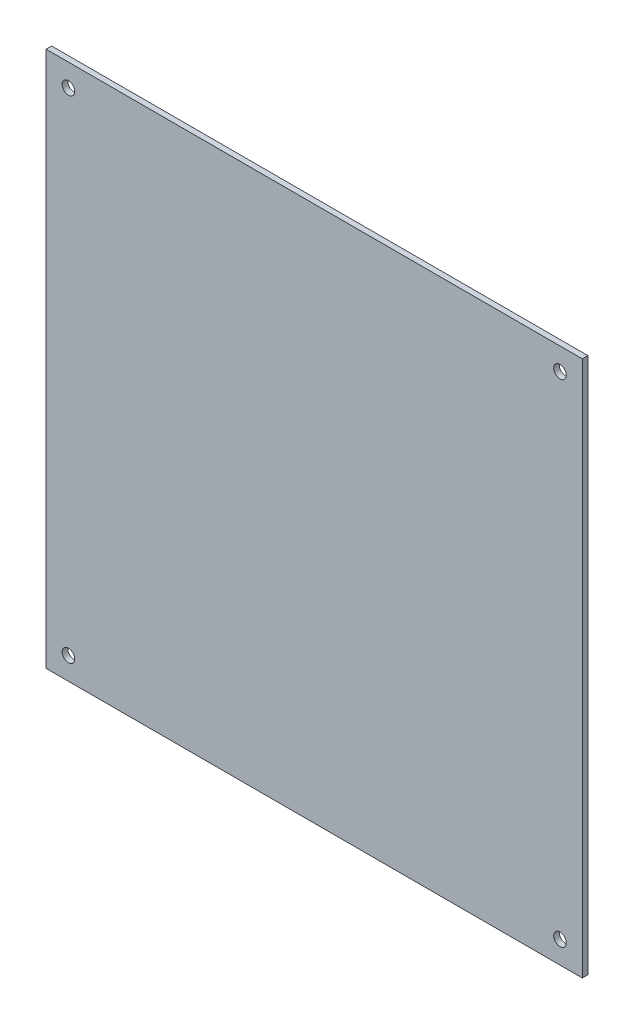
ISO-10303-21;
HEADER;
FILE_DESCRIPTION(('STEP AP214'),'2;1');
FILE_NAME('part.step','',(''),(''),'','','');
FILE_SCHEMA(('AUTOMOTIVE_DESIGN { 1 0 10303 214 1 1 1 1 }'));
ENDSEC;
DATA;
#1=APPLICATION_CONTEXT('core data for automotive mechanical design processes');
#2=APPLICATION_PROTOCOL_DEFINITION('international standard','automotive_design',2000,#1);
#3=PRODUCT_CONTEXT('',#1,'mechanical');
#4=PRODUCT('Part','Part','',(#3));
#5=PRODUCT_RELATED_PRODUCT_CATEGORY('part','',(#4));
#6=PRODUCT_DEFINITION_FORMATION('','',#4);
#7=PRODUCT_DEFINITION_CONTEXT('part definition',#1,'design');
#8=PRODUCT_DEFINITION('design','',#6,#7);
#9=PRODUCT_DEFINITION_SHAPE('','',#8);
#10=(LENGTH_UNIT() NAMED_UNIT(*) SI_UNIT(.MILLI.,.METRE.));
#11=(NAMED_UNIT(*) PLANE_ANGLE_UNIT() SI_UNIT($,.RADIAN.));
#12=(NAMED_UNIT(*) SI_UNIT($,.STERADIAN.) SOLID_ANGLE_UNIT());
#13=UNCERTAINTY_MEASURE_WITH_UNIT(LENGTH_MEASURE(1.E-05),#10,'distance_accuracy_value','');
#14=(GEOMETRIC_REPRESENTATION_CONTEXT(3) GLOBAL_UNCERTAINTY_ASSIGNED_CONTEXT((#13)) GLOBAL_UNIT_ASSIGNED_CONTEXT((#10,
#11,#12)) REPRESENTATION_CONTEXT('',''));
#15=CARTESIAN_POINT('',(0.,0.,0.));
#16=DIRECTION('',(0.,0.,1.));
#17=DIRECTION('',(1.,0.,0.));
#18=AXIS2_PLACEMENT_3D('',#15,#16,#17);
#19=CARTESIAN_POINT('',(0.,0.,3.175));
#20=DIRECTION('',(1.,0.,0.));
#21=DIRECTION('',(0.,1.,0.));
#22=AXIS2_PLACEMENT_3D('',#19,#20,#21);
#23=PLANE('',#22);
#24=DIRECTION('',(0.,-1.,0.));
#25=VECTOR('',#24,1.);
#26=CARTESIAN_POINT('',(0.,0.,0.));
#27=LINE('',#26,#25);
#28=CARTESIAN_POINT('',(0.,0.,0.));
#29=VERTEX_POINT('',#28);
#30=CARTESIAN_POINT('',(0.,-304.8,0.));
#31=VERTEX_POINT('',#30);
#32=EDGE_CURVE('E127',#29,#31,#27,.T.);
#33=ORIENTED_EDGE('',*,*,#32,.T.);
#34=DIRECTION('',(0.,0.,-1.));
#35=VECTOR('',#34,1.);
#36=CARTESIAN_POINT('',(0.,-304.8,3.175));
#37=LINE('',#36,#35);
#38=CARTESIAN_POINT('',(0.,-304.8,3.175));
#39=VERTEX_POINT('',#38);
#40=EDGE_CURVE('E11',#39,#31,#37,.T.);
#41=ORIENTED_EDGE('',*,*,#40,.F.);
#42=DIRECTION('',(0.,-1.,0.));
#43=VECTOR('',#42,1.);
#44=CARTESIAN_POINT('',(0.,0.,3.175));
#45=LINE('',#44,#43);
#46=CARTESIAN_POINT('',(0.,0.,3.175));
#47=VERTEX_POINT('',#46);
#48=EDGE_CURVE('E109',#47,#39,#45,.T.);
#49=ORIENTED_EDGE('',*,*,#48,.F.);
#50=DIRECTION('',(0.,0.,-1.));
#51=VECTOR('',#50,1.);
#52=CARTESIAN_POINT('',(0.,0.,3.175));
#53=LINE('',#52,#51);
#54=EDGE_CURVE('E123',#47,#29,#53,.T.);
#55=ORIENTED_EDGE('',*,*,#54,.T.);
#56=EDGE_LOOP('',(#33,#41,#49,#55));
#57=FACE_BOUND('',#56,.T.);
#58=ADVANCED_FACE('F51',(#57),#23,.F.);
#59=CARTESIAN_POINT('',(0.,-304.8,3.175));
#60=DIRECTION('',(0.,1.,0.));
#61=DIRECTION('',(0.,0.,1.));
#62=AXIS2_PLACEMENT_3D('',#59,#60,#61);
#63=PLANE('',#62);
#64=DIRECTION('',(1.,0.,0.));
#65=VECTOR('',#64,1.);
#66=CARTESIAN_POINT('',(0.,-304.8,0.));
#67=LINE('',#66,#65);
#68=CARTESIAN_POINT('',(304.8,-304.8,0.));
#69=VERTEX_POINT('',#68);
#70=EDGE_CURVE('E114',#31,#69,#67,.T.);
#71=ORIENTED_EDGE('',*,*,#70,.T.);
#72=DIRECTION('',(0.,0.,-1.));
#73=VECTOR('',#72,1.);
#74=CARTESIAN_POINT('',(304.8,-304.8,3.175));
#75=LINE('',#74,#73);
#76=CARTESIAN_POINT('',(304.8,-304.8,3.175));
#77=VERTEX_POINT('',#76);
#78=EDGE_CURVE('E60',#77,#69,#75,.T.);
#79=ORIENTED_EDGE('',*,*,#78,.F.);
#80=DIRECTION('',(1.,0.,0.));
#81=VECTOR('',#80,1.);
#82=CARTESIAN_POINT('',(0.,-304.8,3.175));
#83=LINE('',#82,#81);
#84=EDGE_CURVE('E103',#39,#77,#83,.T.);
#85=ORIENTED_EDGE('',*,*,#84,.F.);
#86=ORIENTED_EDGE('',*,*,#40,.T.);
#87=EDGE_LOOP('',(#71,#79,#85,#86));
#88=FACE_BOUND('',#87,.T.);
#89=ADVANCED_FACE('F113',(#88),#63,.F.);
#90=CARTESIAN_POINT('',(304.8,0.,3.175));
#91=DIRECTION('',(-1.,0.,0.));
#92=DIRECTION('',(0.,-1.,0.));
#93=AXIS2_PLACEMENT_3D('',#90,#91,#92);
#94=PLANE('',#93);
#95=DIRECTION('',(0.,1.,0.));
#96=VECTOR('',#95,1.);
#97=CARTESIAN_POINT('',(304.8,0.,0.));
#98=LINE('',#97,#96);
#99=CARTESIAN_POINT('',(304.8,0.,0.));
#100=VERTEX_POINT('',#99);
#101=EDGE_CURVE('E89',#69,#100,#98,.T.);
#102=ORIENTED_EDGE('',*,*,#101,.T.);
#103=DIRECTION('',(0.,0.,-1.));
#104=VECTOR('',#103,1.);
#105=CARTESIAN_POINT('',(304.8,0.,3.175));
#106=LINE('',#105,#104);
#107=CARTESIAN_POINT('',(304.8,0.,3.175));
#108=VERTEX_POINT('',#107);
#109=EDGE_CURVE('E116',#108,#100,#106,.T.);
#110=ORIENTED_EDGE('',*,*,#109,.F.);
#111=DIRECTION('',(0.,1.,0.));
#112=VECTOR('',#111,1.);
#113=CARTESIAN_POINT('',(304.8,0.,3.175));
#114=LINE('',#113,#112);
#115=EDGE_CURVE('E107',#77,#108,#114,.T.);
#116=ORIENTED_EDGE('',*,*,#115,.F.);
#117=ORIENTED_EDGE('',*,*,#78,.T.);
#118=EDGE_LOOP('',(#102,#110,#116,#117));
#119=FACE_BOUND('',#118,.T.);
#120=ADVANCED_FACE('F117',(#119),#94,.F.);
#121=CARTESIAN_POINT('',(0.,0.,3.175));
#122=DIRECTION('',(0.,-1.,0.));
#123=DIRECTION('',(0.,0.,-1.));
#124=AXIS2_PLACEMENT_3D('',#121,#122,#123);
#125=PLANE('',#124);
#126=DIRECTION('',(-1.,0.,0.));
#127=VECTOR('',#126,1.);
#128=CARTESIAN_POINT('',(0.,0.,0.));
#129=LINE('',#128,#127);
#130=EDGE_CURVE('E96',#100,#29,#129,.T.);
#131=ORIENTED_EDGE('',*,*,#130,.T.);
#132=ORIENTED_EDGE('',*,*,#54,.F.);
#133=DIRECTION('',(-1.,0.,0.));
#134=VECTOR('',#133,1.);
#135=CARTESIAN_POINT('',(0.,0.,3.175));
#136=LINE('',#135,#134);
#137=EDGE_CURVE('E70',#108,#47,#136,.T.);
#138=ORIENTED_EDGE('',*,*,#137,.F.);
#139=ORIENTED_EDGE('',*,*,#109,.T.);
#140=EDGE_LOOP('',(#131,#132,#138,#139));
#141=FACE_BOUND('',#140,.T.);
#142=ADVANCED_FACE('F143',(#141),#125,.F.);
#143=CARTESIAN_POINT('',(0.,0.,3.175));
#144=DIRECTION('',(0.,0.,1.));
#145=DIRECTION('',(1.,0.,0.));
#146=AXIS2_PLACEMENT_3D('',#143,#144,#145);
#147=PLANE('',#146);
#148=CARTESIAN_POINT('',(12.7,-12.7000000000001,3.175));
#149=DIRECTION('',(0.,0.,1.));
#150=DIRECTION('',(1.,0.,0.));
#151=AXIS2_PLACEMENT_3D('',#148,#149,#150);
#152=CIRCLE('',#151,3.57123999999999);
#153=CARTESIAN_POINT('',(16.27124,-12.7000000000001,3.175));
#154=VERTEX_POINT('',#153);
#155=EDGE_CURVE('E179',#154,#154,#152,.T.);
#156=ORIENTED_EDGE('',*,*,#155,.F.);
#157=EDGE_LOOP('',(#156));
#158=FACE_BOUND('',#157,.T.);
#159=CARTESIAN_POINT('',(292.1,-12.7000000000001,3.175));
#160=DIRECTION('',(0.,0.,1.));
#161=DIRECTION('',(1.,0.,0.));
#162=AXIS2_PLACEMENT_3D('',#159,#160,#161);
#163=CIRCLE('',#162,3.57123999999998);
#164=CARTESIAN_POINT('',(295.67124,-12.7000000000001,3.175));
#165=VERTEX_POINT('',#164);
#166=EDGE_CURVE('E171',#165,#165,#163,.T.);
#167=ORIENTED_EDGE('',*,*,#166,.F.);
#168=EDGE_LOOP('',(#167));
#169=FACE_BOUND('',#168,.T.);
#170=CARTESIAN_POINT('',(12.6999999999999,-292.1,3.175));
#171=DIRECTION('',(0.,0.,1.));
#172=DIRECTION('',(1.,0.,0.));
#173=AXIS2_PLACEMENT_3D('',#170,#171,#172);
#174=CIRCLE('',#173,3.57123999999999);
#175=CARTESIAN_POINT('',(16.2712399999999,-292.1,3.175));
#176=VERTEX_POINT('',#175);
#177=EDGE_CURVE('E163',#176,#176,#174,.T.);
#178=ORIENTED_EDGE('',*,*,#177,.F.);
#179=EDGE_LOOP('',(#178));
#180=FACE_BOUND('',#179,.T.);
#181=CARTESIAN_POINT('',(292.1,-292.1,3.175));
#182=DIRECTION('',(0.,0.,1.));
#183=DIRECTION('',(1.,0.,0.));
#184=AXIS2_PLACEMENT_3D('',#181,#182,#183);
#185=CIRCLE('',#184,3.57123999999998);
#186=CARTESIAN_POINT('',(295.67124,-292.1,3.175));
#187=VERTEX_POINT('',#186);
#188=EDGE_CURVE('E155',#187,#187,#185,.T.);
#189=ORIENTED_EDGE('',*,*,#188,.F.);
#190=EDGE_LOOP('',(#189));
#191=FACE_BOUND('',#190,.T.);
#192=ORIENTED_EDGE('',*,*,#48,.T.);
#193=ORIENTED_EDGE('',*,*,#84,.T.);
#194=ORIENTED_EDGE('',*,*,#115,.T.);
#195=ORIENTED_EDGE('',*,*,#137,.T.);
#196=EDGE_LOOP('',(#192,#193,#194,#195));
#197=FACE_BOUND('',#196,.T.);
#198=ADVANCED_FACE('F105',(#158,#169,#180,#191,#197),#147,.T.);
#199=CARTESIAN_POINT('',(0.,0.,0.));
#200=DIRECTION('',(0.,0.,1.));
#201=DIRECTION('',(1.,0.,0.));
#202=AXIS2_PLACEMENT_3D('',#199,#200,#201);
#203=PLANE('',#202);
#204=CARTESIAN_POINT('',(12.7,-12.7000000000001,0.));
#205=DIRECTION('',(0.,0.,1.));
#206=DIRECTION('',(1.,0.,0.));
#207=AXIS2_PLACEMENT_3D('',#204,#205,#206);
#208=CIRCLE('',#207,3.57123999999999);
#209=CARTESIAN_POINT('',(16.27124,-12.7000000000001,0.));
#210=VERTEX_POINT('',#209);
#211=EDGE_CURVE('E175',#210,#210,#208,.T.);
#212=ORIENTED_EDGE('',*,*,#211,.T.);
#213=EDGE_LOOP('',(#212));
#214=FACE_BOUND('',#213,.T.);
#215=CARTESIAN_POINT('',(292.1,-12.7000000000001,0.));
#216=DIRECTION('',(0.,0.,1.));
#217=DIRECTION('',(1.,0.,0.));
#218=AXIS2_PLACEMENT_3D('',#215,#216,#217);
#219=CIRCLE('',#218,3.57123999999998);
#220=CARTESIAN_POINT('',(295.67124,-12.7000000000001,0.));
#221=VERTEX_POINT('',#220);
#222=EDGE_CURVE('E167',#221,#221,#219,.T.);
#223=ORIENTED_EDGE('',*,*,#222,.T.);
#224=EDGE_LOOP('',(#223));
#225=FACE_BOUND('',#224,.T.);
#226=CARTESIAN_POINT('',(12.6999999999999,-292.1,0.));
#227=DIRECTION('',(0.,0.,1.));
#228=DIRECTION('',(1.,0.,0.));
#229=AXIS2_PLACEMENT_3D('',#226,#227,#228);
#230=CIRCLE('',#229,3.57123999999999);
#231=CARTESIAN_POINT('',(16.2712399999999,-292.1,0.));
#232=VERTEX_POINT('',#231);
#233=EDGE_CURVE('E159',#232,#232,#230,.T.);
#234=ORIENTED_EDGE('',*,*,#233,.T.);
#235=EDGE_LOOP('',(#234));
#236=FACE_BOUND('',#235,.T.);
#237=CARTESIAN_POINT('',(292.1,-292.1,0.));
#238=DIRECTION('',(0.,0.,1.));
#239=DIRECTION('',(1.,0.,0.));
#240=AXIS2_PLACEMENT_3D('',#237,#238,#239);
#241=CIRCLE('',#240,3.57123999999998);
#242=CARTESIAN_POINT('',(295.67124,-292.1,0.));
#243=VERTEX_POINT('',#242);
#244=EDGE_CURVE('E131',#243,#243,#241,.T.);
#245=ORIENTED_EDGE('',*,*,#244,.T.);
#246=EDGE_LOOP('',(#245));
#247=FACE_BOUND('',#246,.T.);
#248=ORIENTED_EDGE('',*,*,#32,.F.);
#249=ORIENTED_EDGE('',*,*,#130,.F.);
#250=ORIENTED_EDGE('',*,*,#101,.F.);
#251=ORIENTED_EDGE('',*,*,#70,.F.);
#252=EDGE_LOOP('',(#248,#249,#250,#251));
#253=FACE_BOUND('',#252,.T.);
#254=ADVANCED_FACE('F146',(#214,#225,#236,#247,#253),#203,.F.);
#255=CARTESIAN_POINT('',(292.1,-292.1,3.175));
#256=DIRECTION('',(0.,0.,1.));
#257=DIRECTION('',(1.,0.,0.));
#258=AXIS2_PLACEMENT_3D('',#255,#256,#257);
#259=CYLINDRICAL_SURFACE('',#258,3.57123999999998);
#260=ORIENTED_EDGE('',*,*,#244,.F.);
#261=EDGE_LOOP('',(#260));
#262=FACE_BOUND('',#261,.T.);
#263=ORIENTED_EDGE('',*,*,#188,.T.);
#264=EDGE_LOOP('',(#263));
#265=FACE_BOUND('',#264,.T.);
#266=ADVANCED_FACE('F197',(#262,#265),#259,.F.);
#267=CARTESIAN_POINT('',(12.6999999999999,-292.1,3.175));
#268=DIRECTION('',(0.,0.,1.));
#269=DIRECTION('',(1.,0.,0.));
#270=AXIS2_PLACEMENT_3D('',#267,#268,#269);
#271=CYLINDRICAL_SURFACE('',#270,3.57123999999999);
#272=ORIENTED_EDGE('',*,*,#233,.F.);
#273=EDGE_LOOP('',(#272));
#274=FACE_BOUND('',#273,.T.);
#275=ORIENTED_EDGE('',*,*,#177,.T.);
#276=EDGE_LOOP('',(#275));
#277=FACE_BOUND('',#276,.T.);
#278=ADVANCED_FACE('F199',(#274,#277),#271,.F.);
#279=CARTESIAN_POINT('',(292.1,-12.7000000000001,3.175));
#280=DIRECTION('',(0.,0.,1.));
#281=DIRECTION('',(1.,0.,0.));
#282=AXIS2_PLACEMENT_3D('',#279,#280,#281);
#283=CYLINDRICAL_SURFACE('',#282,3.57123999999998);
#284=ORIENTED_EDGE('',*,*,#222,.F.);
#285=EDGE_LOOP('',(#284));
#286=FACE_BOUND('',#285,.T.);
#287=ORIENTED_EDGE('',*,*,#166,.T.);
#288=EDGE_LOOP('',(#287));
#289=FACE_BOUND('',#288,.T.);
#290=ADVANCED_FACE('F206',(#286,#289),#283,.F.);
#291=CARTESIAN_POINT('',(12.7,-12.7000000000001,3.175));
#292=DIRECTION('',(0.,0.,1.));
#293=DIRECTION('',(1.,0.,0.));
#294=AXIS2_PLACEMENT_3D('',#291,#292,#293);
#295=CYLINDRICAL_SURFACE('',#294,3.57123999999999);
#296=ORIENTED_EDGE('',*,*,#211,.F.);
#297=EDGE_LOOP('',(#296));
#298=FACE_BOUND('',#297,.T.);
#299=ORIENTED_EDGE('',*,*,#155,.T.);
#300=EDGE_LOOP('',(#299));
#301=FACE_BOUND('',#300,.T.);
#302=ADVANCED_FACE('F186',(#298,#301),#295,.F.);
#303=CLOSED_SHELL('',(#58,#89,#120,#142,#198,#254,#266,#278,#290,#302));
#304=MANIFOLD_SOLID_BREP('B2',#303);
#305=ADVANCED_BREP_SHAPE_REPRESENTATION('',(#18,#304),#14);
#306=SHAPE_DEFINITION_REPRESENTATION(#9,#305);
ENDSEC;
END-ISO-10303-21;
